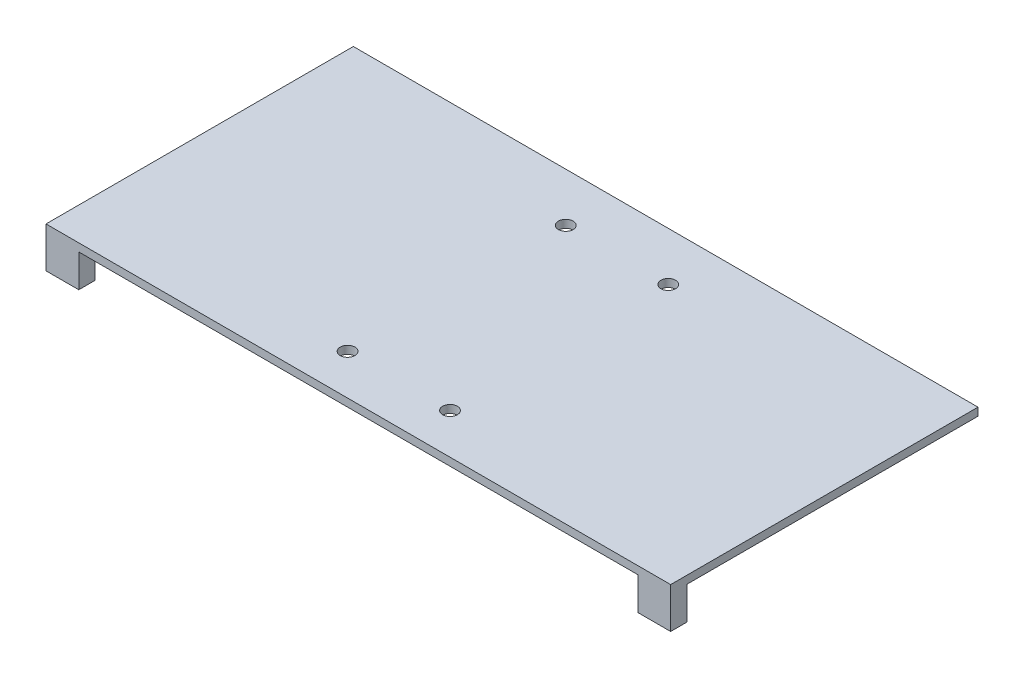
ISO-10303-21;
HEADER;
FILE_DESCRIPTION(('STEP AP214'),'2;1');
FILE_NAME('part.step','',(''),(''),'','','');
FILE_SCHEMA(('AUTOMOTIVE_DESIGN { 1 0 10303 214 1 1 1 1 }'));
ENDSEC;
DATA;
#1=APPLICATION_CONTEXT('core data for automotive mechanical design processes');
#2=APPLICATION_PROTOCOL_DEFINITION('international standard','automotive_design',2000,#1);
#3=PRODUCT_CONTEXT('',#1,'mechanical');
#4=PRODUCT('Part','Part','',(#3));
#5=PRODUCT_RELATED_PRODUCT_CATEGORY('part','',(#4));
#6=PRODUCT_DEFINITION_FORMATION('','',#4);
#7=PRODUCT_DEFINITION_CONTEXT('part definition',#1,'design');
#8=PRODUCT_DEFINITION('design','',#6,#7);
#9=PRODUCT_DEFINITION_SHAPE('','',#8);
#10=(LENGTH_UNIT() NAMED_UNIT(*) SI_UNIT(.MILLI.,.METRE.));
#11=(NAMED_UNIT(*) PLANE_ANGLE_UNIT() SI_UNIT($,.RADIAN.));
#12=(NAMED_UNIT(*) SI_UNIT($,.STERADIAN.) SOLID_ANGLE_UNIT());
#13=UNCERTAINTY_MEASURE_WITH_UNIT(LENGTH_MEASURE(1.E-05),#10,'distance_accuracy_value','');
#14=(GEOMETRIC_REPRESENTATION_CONTEXT(3) GLOBAL_UNCERTAINTY_ASSIGNED_CONTEXT((#13)) GLOBAL_UNIT_ASSIGNED_CONTEXT((#10,
#11,#12)) REPRESENTATION_CONTEXT('',''));
#15=CARTESIAN_POINT('',(0.,0.,0.));
#16=DIRECTION('',(0.,0.,1.));
#17=DIRECTION('',(1.,0.,0.));
#18=AXIS2_PLACEMENT_3D('',#15,#16,#17);
#19=CARTESIAN_POINT('',(0.,0.,0.));
#20=DIRECTION('',(0.,1.,0.));
#21=DIRECTION('',(0.,0.,1.));
#22=AXIS2_PLACEMENT_3D('',#19,#20,#21);
#23=PLANE('',#22);
#24=CARTESIAN_POINT('',(56.3375,0.,41.35437754));
#25=DIRECTION('',(0.,1.,0.));
#26=DIRECTION('',(0.,0.,1.));
#27=AXIS2_PLACEMENT_3D('',#24,#25,#26);
#28=CIRCLE('',#27,1.14299999999999);
#29=CARTESIAN_POINT('',(56.3375,0.,42.49737754));
#30=VERTEX_POINT('',#29);
#31=EDGE_CURVE('E181',#30,#30,#28,.F.);
#32=ORIENTED_EDGE('',*,*,#31,.F.);
#33=EDGE_LOOP('',(#32));
#34=FACE_BOUND('',#33,.T.);
#35=CARTESIAN_POINT('',(40.4625,0.,41.35437754));
#36=DIRECTION('',(0.,1.,0.));
#37=DIRECTION('',(0.,0.,1.));
#38=AXIS2_PLACEMENT_3D('',#35,#36,#37);
#39=CIRCLE('',#38,1.143);
#40=CARTESIAN_POINT('',(40.4625,0.,42.49737754));
#41=VERTEX_POINT('',#40);
#42=EDGE_CURVE('E182',#41,#41,#39,.F.);
#43=ORIENTED_EDGE('',*,*,#42,.F.);
#44=EDGE_LOOP('',(#43));
#45=FACE_BOUND('',#44,.T.);
#46=CARTESIAN_POINT('',(56.3375,0.,7.54062500000001));
#47=DIRECTION('',(0.,1.,0.));
#48=DIRECTION('',(0.,0.,1.));
#49=AXIS2_PLACEMENT_3D('',#46,#47,#48);
#50=CIRCLE('',#49,1.143);
#51=CARTESIAN_POINT('',(56.3375,0.,8.683625));
#52=VERTEX_POINT('',#51);
#53=EDGE_CURVE('E193',#52,#52,#50,.F.);
#54=ORIENTED_EDGE('',*,*,#53,.F.);
#55=EDGE_LOOP('',(#54));
#56=FACE_BOUND('',#55,.T.);
#57=CARTESIAN_POINT('',(40.4625,0.,7.54062500000001));
#58=DIRECTION('',(0.,1.,0.));
#59=DIRECTION('',(0.,0.,1.));
#60=AXIS2_PLACEMENT_3D('',#57,#58,#59);
#61=CIRCLE('',#60,1.143);
#62=CARTESIAN_POINT('',(40.4625,0.,8.683625));
#63=VERTEX_POINT('',#62);
#64=EDGE_CURVE('E194',#63,#63,#61,.F.);
#65=ORIENTED_EDGE('',*,*,#64,.F.);
#66=EDGE_LOOP('',(#65));
#67=FACE_BOUND('',#66,.T.);
#68=DIRECTION('',(1.,0.,0.));
#69=VECTOR('',#68,1.);
#70=CARTESIAN_POINT('',(0.,0.,45.08500254));
#71=LINE('',#70,#69);
#72=CARTESIAN_POINT('',(0.,0.,45.08500254));
#73=VERTEX_POINT('',#72);
#74=CARTESIAN_POINT('',(5.08000000000001,0.,45.08500254));
#75=VERTEX_POINT('',#74);
#76=EDGE_CURVE('E244',#73,#75,#71,.T.);
#77=ORIENTED_EDGE('',*,*,#76,.F.);
#78=DIRECTION('',(0.,0.,1.));
#79=VECTOR('',#78,1.);
#80=CARTESIAN_POINT('',(0.,0.,0.));
#81=LINE('',#80,#79);
#82=CARTESIAN_POINT('',(0.,0.,0.));
#83=VERTEX_POINT('',#82);
#84=EDGE_CURVE('E147',#83,#73,#81,.T.);
#85=ORIENTED_EDGE('',*,*,#84,.F.);
#86=DIRECTION('',(-1.,0.,0.));
#87=VECTOR('',#86,1.);
#88=CARTESIAN_POINT('',(0.,0.,0.));
#89=LINE('',#88,#87);
#90=CARTESIAN_POINT('',(96.799999948,0.,0.));
#91=VERTEX_POINT('',#90);
#92=EDGE_CURVE('E205',#91,#83,#89,.T.);
#93=ORIENTED_EDGE('',*,*,#92,.F.);
#94=DIRECTION('',(0.,0.,-1.));
#95=VECTOR('',#94,1.);
#96=CARTESIAN_POINT('',(96.799999948,0.,0.));
#97=LINE('',#96,#95);
#98=CARTESIAN_POINT('',(96.799999948,0.,45.08500254));
#99=VERTEX_POINT('',#98);
#100=EDGE_CURVE('E214',#99,#91,#97,.T.);
#101=ORIENTED_EDGE('',*,*,#100,.F.);
#102=DIRECTION('',(1.,0.,0.));
#103=VECTOR('',#102,1.);
#104=CARTESIAN_POINT('',(96.799999948,0.,45.08500254));
#105=LINE('',#104,#103);
#106=CARTESIAN_POINT('',(91.719999948,0.,45.08500254));
#107=VERTEX_POINT('',#106);
#108=EDGE_CURVE('E151',#107,#99,#105,.T.);
#109=ORIENTED_EDGE('',*,*,#108,.F.);
#110=DIRECTION('',(0.,0.,-1.));
#111=VECTOR('',#110,1.);
#112=CARTESIAN_POINT('',(91.719999948,0.,45.08500254));
#113=LINE('',#112,#111);
#114=CARTESIAN_POINT('',(91.719999948,0.,47.62500254));
#115=VERTEX_POINT('',#114);
#116=EDGE_CURVE('E148',#115,#107,#113,.T.);
#117=ORIENTED_EDGE('',*,*,#116,.F.);
#118=DIRECTION('',(1.,0.,0.));
#119=VECTOR('',#118,1.);
#120=CARTESIAN_POINT('',(0.,0.,47.62500254));
#121=LINE('',#120,#119);
#122=CARTESIAN_POINT('',(5.08000000000001,0.,47.62500254));
#123=VERTEX_POINT('',#122);
#124=EDGE_CURVE('E67',#123,#115,#121,.T.);
#125=ORIENTED_EDGE('',*,*,#124,.F.);
#126=DIRECTION('',(0.,0.,1.));
#127=VECTOR('',#126,1.);
#128=CARTESIAN_POINT('',(5.08000000000001,0.,47.62500254));
#129=LINE('',#128,#127);
#130=EDGE_CURVE('E142',#75,#123,#129,.T.);
#131=ORIENTED_EDGE('',*,*,#130,.F.);
#132=EDGE_LOOP('',(#77,#85,#93,#101,#109,#117,#125,#131));
#133=FACE_BOUND('',#132,.T.);
#134=ADVANCED_FACE('F47',(#34,#45,#56,#67,#133),#23,.F.);
#135=CARTESIAN_POINT('',(0.,1.2192,0.));
#136=DIRECTION('',(1.,0.,0.));
#137=DIRECTION('',(0.,0.,-1.));
#138=AXIS2_PLACEMENT_3D('',#135,#136,#137);
#139=PLANE('',#138);
#140=ORIENTED_EDGE('',*,*,#84,.T.);
#141=DIRECTION('',(0.,1.,0.));
#142=VECTOR('',#141,1.);
#143=CARTESIAN_POINT('',(0.,-5.08,45.08500254));
#144=LINE('',#143,#142);
#145=CARTESIAN_POINT('',(0.,-5.08,45.08500254));
#146=VERTEX_POINT('',#145);
#147=EDGE_CURVE('E127',#146,#73,#144,.T.);
#148=ORIENTED_EDGE('',*,*,#147,.F.);
#149=DIRECTION('',(0.,0.,-1.));
#150=VECTOR('',#149,1.);
#151=CARTESIAN_POINT('',(0.,-5.08,47.62500254));
#152=LINE('',#151,#150);
#153=CARTESIAN_POINT('',(0.,-5.08,47.62500254));
#154=VERTEX_POINT('',#153);
#155=EDGE_CURVE('E134',#154,#146,#152,.T.);
#156=ORIENTED_EDGE('',*,*,#155,.F.);
#157=DIRECTION('',(0.,-1.,0.));
#158=VECTOR('',#157,1.);
#159=CARTESIAN_POINT('',(0.,1.2192,47.62500254));
#160=LINE('',#159,#158);
#161=CARTESIAN_POINT('',(0.,1.2192,47.62500254));
#162=VERTEX_POINT('',#161);
#163=EDGE_CURVE('E13',#162,#154,#160,.T.);
#164=ORIENTED_EDGE('',*,*,#163,.F.);
#165=DIRECTION('',(0.,0.,1.));
#166=VECTOR('',#165,1.);
#167=CARTESIAN_POINT('',(0.,1.2192,0.));
#168=LINE('',#167,#166);
#169=CARTESIAN_POINT('',(0.,1.2192,0.));
#170=VERTEX_POINT('',#169);
#171=EDGE_CURVE('E201',#170,#162,#168,.T.);
#172=ORIENTED_EDGE('',*,*,#171,.F.);
#173=DIRECTION('',(0.,-1.,0.));
#174=VECTOR('',#173,1.);
#175=CARTESIAN_POINT('',(0.,1.2192,0.));
#176=LINE('',#175,#174);
#177=EDGE_CURVE('E211',#170,#83,#176,.T.);
#178=ORIENTED_EDGE('',*,*,#177,.T.);
#179=EDGE_LOOP('',(#140,#148,#156,#164,#172,#178));
#180=FACE_BOUND('',#179,.T.);
#181=ADVANCED_FACE('F49',(#180),#139,.F.);
#182=CARTESIAN_POINT('',(0.,1.2192,47.62500254));
#183=DIRECTION('',(0.,0.,-1.));
#184=DIRECTION('',(-1.,0.,0.));
#185=AXIS2_PLACEMENT_3D('',#182,#183,#184);
#186=PLANE('',#185);
#187=ORIENTED_EDGE('',*,*,#163,.T.);
#188=DIRECTION('',(-1.,0.,0.));
#189=VECTOR('',#188,1.);
#190=CARTESIAN_POINT('',(0.,-5.08,47.62500254));
#191=LINE('',#190,#189);
#192=CARTESIAN_POINT('',(5.08000000000001,-5.08,47.62500254));
#193=VERTEX_POINT('',#192);
#194=EDGE_CURVE('E139',#193,#154,#191,.T.);
#195=ORIENTED_EDGE('',*,*,#194,.F.);
#196=DIRECTION('',(0.,1.,0.));
#197=VECTOR('',#196,1.);
#198=CARTESIAN_POINT('',(5.08000000000001,-5.08,47.62500254));
#199=LINE('',#198,#197);
#200=EDGE_CURVE('E62',#193,#123,#199,.T.);
#201=ORIENTED_EDGE('',*,*,#200,.T.);
#202=ORIENTED_EDGE('',*,*,#124,.T.);
#203=DIRECTION('',(0.,1.,0.));
#204=VECTOR('',#203,1.);
#205=CARTESIAN_POINT('',(91.719999948,-5.08,47.62500254));
#206=LINE('',#205,#204);
#207=CARTESIAN_POINT('',(91.719999948,-5.08,47.62500254));
#208=VERTEX_POINT('',#207);
#209=EDGE_CURVE('E174',#208,#115,#206,.T.);
#210=ORIENTED_EDGE('',*,*,#209,.F.);
#211=DIRECTION('',(-1.,0.,0.));
#212=VECTOR('',#211,1.);
#213=CARTESIAN_POINT('',(91.719999948,-5.08,47.62500254));
#214=LINE('',#213,#212);
#215=CARTESIAN_POINT('',(96.799999948,-5.08,47.62500254));
#216=VERTEX_POINT('',#215);
#217=EDGE_CURVE('E156',#216,#208,#214,.T.);
#218=ORIENTED_EDGE('',*,*,#217,.F.);
#219=DIRECTION('',(0.,-1.,0.));
#220=VECTOR('',#219,1.);
#221=CARTESIAN_POINT('',(96.799999948,1.2192,47.62500254));
#222=LINE('',#221,#220);
#223=CARTESIAN_POINT('',(96.799999948,1.2192,47.62500254));
#224=VERTEX_POINT('',#223);
#225=EDGE_CURVE('E55',#224,#216,#222,.T.);
#226=ORIENTED_EDGE('',*,*,#225,.F.);
#227=DIRECTION('',(1.,0.,0.));
#228=VECTOR('',#227,1.);
#229=CARTESIAN_POINT('',(0.,1.2192,47.62500254));
#230=LINE('',#229,#228);
#231=EDGE_CURVE('E204',#162,#224,#230,.T.);
#232=ORIENTED_EDGE('',*,*,#231,.F.);
#233=EDGE_LOOP('',(#187,#195,#201,#202,#210,#218,#226,#232));
#234=FACE_BOUND('',#233,.T.);
#235=ADVANCED_FACE('F231',(#234),#186,.F.);
#236=CARTESIAN_POINT('',(96.799999948,1.2192,0.));
#237=DIRECTION('',(-1.,0.,0.));
#238=DIRECTION('',(0.,0.,1.));
#239=AXIS2_PLACEMENT_3D('',#236,#237,#238);
#240=PLANE('',#239);
#241=ORIENTED_EDGE('',*,*,#225,.T.);
#242=DIRECTION('',(0.,0.,1.));
#243=VECTOR('',#242,1.);
#244=CARTESIAN_POINT('',(96.799999948,-5.08,47.62500254));
#245=LINE('',#244,#243);
#246=CARTESIAN_POINT('',(96.799999948,-5.08,45.08500254));
#247=VERTEX_POINT('',#246);
#248=EDGE_CURVE('E163',#247,#216,#245,.T.);
#249=ORIENTED_EDGE('',*,*,#248,.F.);
#250=DIRECTION('',(0.,1.,0.));
#251=VECTOR('',#250,1.);
#252=CARTESIAN_POINT('',(96.799999948,-5.08,45.08500254));
#253=LINE('',#252,#251);
#254=EDGE_CURVE('E165',#247,#99,#253,.T.);
#255=ORIENTED_EDGE('',*,*,#254,.T.);
#256=ORIENTED_EDGE('',*,*,#100,.T.);
#257=DIRECTION('',(0.,-1.,0.));
#258=VECTOR('',#257,1.);
#259=CARTESIAN_POINT('',(96.799999948,1.2192,0.));
#260=LINE('',#259,#258);
#261=CARTESIAN_POINT('',(96.799999948,1.2192,0.));
#262=VERTEX_POINT('',#261);
#263=EDGE_CURVE('E218',#262,#91,#260,.T.);
#264=ORIENTED_EDGE('',*,*,#263,.F.);
#265=DIRECTION('',(0.,0.,-1.));
#266=VECTOR('',#265,1.);
#267=CARTESIAN_POINT('',(96.799999948,1.2192,0.));
#268=LINE('',#267,#266);
#269=EDGE_CURVE('E207',#224,#262,#268,.T.);
#270=ORIENTED_EDGE('',*,*,#269,.F.);
#271=EDGE_LOOP('',(#241,#249,#255,#256,#264,#270));
#272=FACE_BOUND('',#271,.T.);
#273=ADVANCED_FACE('F224',(#272),#240,.F.);
#274=CARTESIAN_POINT('',(0.,1.2192,0.));
#275=DIRECTION('',(0.,0.,1.));
#276=DIRECTION('',(1.,0.,0.));
#277=AXIS2_PLACEMENT_3D('',#274,#275,#276);
#278=PLANE('',#277);
#279=ORIENTED_EDGE('',*,*,#92,.T.);
#280=ORIENTED_EDGE('',*,*,#177,.F.);
#281=DIRECTION('',(-1.,0.,0.));
#282=VECTOR('',#281,1.);
#283=CARTESIAN_POINT('',(0.,1.2192,0.));
#284=LINE('',#283,#282);
#285=EDGE_CURVE('E209',#262,#170,#284,.T.);
#286=ORIENTED_EDGE('',*,*,#285,.F.);
#287=ORIENTED_EDGE('',*,*,#263,.T.);
#288=EDGE_LOOP('',(#279,#280,#286,#287));
#289=FACE_BOUND('',#288,.T.);
#290=ADVANCED_FACE('F241',(#289),#278,.F.);
#291=CARTESIAN_POINT('',(0.,1.2192,0.));
#292=DIRECTION('',(0.,1.,0.));
#293=DIRECTION('',(0.,0.,1.));
#294=AXIS2_PLACEMENT_3D('',#291,#292,#293);
#295=PLANE('',#294);
#296=CARTESIAN_POINT('',(56.3375,1.2192,41.35437754));
#297=DIRECTION('',(0.,1.,0.));
#298=DIRECTION('',(0.,0.,1.));
#299=AXIS2_PLACEMENT_3D('',#296,#297,#298);
#300=CIRCLE('',#299,1.14299999999999);
#301=CARTESIAN_POINT('',(56.3375,1.2192,42.49737754));
#302=VERTEX_POINT('',#301);
#303=EDGE_CURVE('E178',#302,#302,#300,.T.);
#304=ORIENTED_EDGE('',*,*,#303,.F.);
#305=EDGE_LOOP('',(#304));
#306=FACE_BOUND('',#305,.T.);
#307=CARTESIAN_POINT('',(40.4625,1.2192,41.35437754));
#308=DIRECTION('',(0.,1.,0.));
#309=DIRECTION('',(0.,0.,1.));
#310=AXIS2_PLACEMENT_3D('',#307,#308,#309);
#311=CIRCLE('',#310,1.143);
#312=CARTESIAN_POINT('',(40.4625,1.2192,42.49737754));
#313=VERTEX_POINT('',#312);
#314=EDGE_CURVE('E177',#313,#313,#311,.T.);
#315=ORIENTED_EDGE('',*,*,#314,.F.);
#316=EDGE_LOOP('',(#315));
#317=FACE_BOUND('',#316,.T.);
#318=CARTESIAN_POINT('',(56.3375,1.2192,7.54062500000001));
#319=DIRECTION('',(0.,1.,0.));
#320=DIRECTION('',(0.,0.,1.));
#321=AXIS2_PLACEMENT_3D('',#318,#319,#320);
#322=CIRCLE('',#321,1.143);
#323=CARTESIAN_POINT('',(56.3375,1.2192,8.683625));
#324=VERTEX_POINT('',#323);
#325=EDGE_CURVE('E190',#324,#324,#322,.T.);
#326=ORIENTED_EDGE('',*,*,#325,.F.);
#327=EDGE_LOOP('',(#326));
#328=FACE_BOUND('',#327,.T.);
#329=CARTESIAN_POINT('',(40.4625,1.2192,7.54062500000001));
#330=DIRECTION('',(0.,1.,0.));
#331=DIRECTION('',(0.,0.,1.));
#332=AXIS2_PLACEMENT_3D('',#329,#330,#331);
#333=CIRCLE('',#332,1.143);
#334=CARTESIAN_POINT('',(40.4625,1.2192,8.683625));
#335=VERTEX_POINT('',#334);
#336=EDGE_CURVE('E185',#335,#335,#333,.T.);
#337=ORIENTED_EDGE('',*,*,#336,.F.);
#338=EDGE_LOOP('',(#337));
#339=FACE_BOUND('',#338,.T.);
#340=ORIENTED_EDGE('',*,*,#171,.T.);
#341=ORIENTED_EDGE('',*,*,#231,.T.);
#342=ORIENTED_EDGE('',*,*,#269,.T.);
#343=ORIENTED_EDGE('',*,*,#285,.T.);
#344=EDGE_LOOP('',(#340,#341,#342,#343));
#345=FACE_BOUND('',#344,.T.);
#346=ADVANCED_FACE('F253',(#306,#317,#328,#339,#345),#295,.T.);
#347=CARTESIAN_POINT('',(40.4625,-0.000999999999999916,7.54062500000001));
#348=DIRECTION('',(0.,1.,0.));
#349=DIRECTION('',(0.,0.,1.));
#350=AXIS2_PLACEMENT_3D('',#347,#348,#349);
#351=CYLINDRICAL_SURFACE('',#350,1.143);
#352=ORIENTED_EDGE('',*,*,#336,.T.);
#353=EDGE_LOOP('',(#352));
#354=FACE_BOUND('',#353,.T.);
#355=ORIENTED_EDGE('',*,*,#64,.T.);
#356=EDGE_LOOP('',(#355));
#357=FACE_BOUND('',#356,.T.);
#358=ADVANCED_FACE('F255',(#354,#357),#351,.F.);
#359=CARTESIAN_POINT('',(56.3375,-0.000999999999999916,7.54062500000001));
#360=DIRECTION('',(0.,1.,0.));
#361=DIRECTION('',(0.,0.,1.));
#362=AXIS2_PLACEMENT_3D('',#359,#360,#361);
#363=CYLINDRICAL_SURFACE('',#362,1.143);
#364=ORIENTED_EDGE('',*,*,#325,.T.);
#365=EDGE_LOOP('',(#364));
#366=FACE_BOUND('',#365,.T.);
#367=ORIENTED_EDGE('',*,*,#53,.T.);
#368=EDGE_LOOP('',(#367));
#369=FACE_BOUND('',#368,.T.);
#370=ADVANCED_FACE('F262',(#366,#369),#363,.F.);
#371=CARTESIAN_POINT('',(40.4625,-0.000999999999999916,41.35437754));
#372=DIRECTION('',(0.,1.,0.));
#373=DIRECTION('',(0.,0.,1.));
#374=AXIS2_PLACEMENT_3D('',#371,#372,#373);
#375=CYLINDRICAL_SURFACE('',#374,1.143);
#376=ORIENTED_EDGE('',*,*,#314,.T.);
#377=EDGE_LOOP('',(#376));
#378=FACE_BOUND('',#377,.T.);
#379=ORIENTED_EDGE('',*,*,#42,.T.);
#380=EDGE_LOOP('',(#379));
#381=FACE_BOUND('',#380,.T.);
#382=ADVANCED_FACE('F308',(#378,#381),#375,.F.);
#383=CARTESIAN_POINT('',(56.3375,-0.000999999999999916,41.35437754));
#384=DIRECTION('',(0.,1.,0.));
#385=DIRECTION('',(0.,0.,1.));
#386=AXIS2_PLACEMENT_3D('',#383,#384,#385);
#387=CYLINDRICAL_SURFACE('',#386,1.14299999999999);
#388=ORIENTED_EDGE('',*,*,#303,.T.);
#389=EDGE_LOOP('',(#388));
#390=FACE_BOUND('',#389,.T.);
#391=ORIENTED_EDGE('',*,*,#31,.T.);
#392=EDGE_LOOP('',(#391));
#393=FACE_BOUND('',#392,.T.);
#394=ADVANCED_FACE('F322',(#390,#393),#387,.F.);
#395=CARTESIAN_POINT('',(91.719999948,-5.08,45.08500254));
#396=DIRECTION('',(1.,0.,0.));
#397=DIRECTION('',(0.,0.,-1.));
#398=AXIS2_PLACEMENT_3D('',#395,#396,#397);
#399=PLANE('',#398);
#400=ORIENTED_EDGE('',*,*,#116,.T.);
#401=DIRECTION('',(0.,1.,0.));
#402=VECTOR('',#401,1.);
#403=CARTESIAN_POINT('',(91.719999948,-5.08,45.08500254));
#404=LINE('',#403,#402);
#405=CARTESIAN_POINT('',(91.719999948,-5.08,45.08500254));
#406=VERTEX_POINT('',#405);
#407=EDGE_CURVE('E171',#406,#107,#404,.T.);
#408=ORIENTED_EDGE('',*,*,#407,.F.);
#409=DIRECTION('',(0.,0.,-1.));
#410=VECTOR('',#409,1.);
#411=CARTESIAN_POINT('',(91.719999948,-5.08,45.08500254));
#412=LINE('',#411,#410);
#413=EDGE_CURVE('E159',#208,#406,#412,.T.);
#414=ORIENTED_EDGE('',*,*,#413,.F.);
#415=ORIENTED_EDGE('',*,*,#209,.T.);
#416=EDGE_LOOP('',(#400,#408,#414,#415));
#417=FACE_BOUND('',#416,.T.);
#418=ADVANCED_FACE('F233',(#417),#399,.F.);
#419=CARTESIAN_POINT('',(96.799999948,-5.08,45.08500254));
#420=DIRECTION('',(0.,0.,1.));
#421=DIRECTION('',(1.,0.,0.));
#422=AXIS2_PLACEMENT_3D('',#419,#420,#421);
#423=PLANE('',#422);
#424=ORIENTED_EDGE('',*,*,#108,.T.);
#425=ORIENTED_EDGE('',*,*,#254,.F.);
#426=DIRECTION('',(1.,0.,0.));
#427=VECTOR('',#426,1.);
#428=CARTESIAN_POINT('',(96.799999948,-5.08,45.08500254));
#429=LINE('',#428,#427);
#430=EDGE_CURVE('E161',#406,#247,#429,.T.);
#431=ORIENTED_EDGE('',*,*,#430,.F.);
#432=ORIENTED_EDGE('',*,*,#407,.T.);
#433=EDGE_LOOP('',(#424,#425,#431,#432));
#434=FACE_BOUND('',#433,.T.);
#435=ADVANCED_FACE('F236',(#434),#423,.F.);
#436=CARTESIAN_POINT('',(0.,-5.08,0.));
#437=DIRECTION('',(0.,1.,0.));
#438=DIRECTION('',(0.,0.,1.));
#439=AXIS2_PLACEMENT_3D('',#436,#437,#438);
#440=PLANE('',#439);
#441=ORIENTED_EDGE('',*,*,#217,.T.);
#442=ORIENTED_EDGE('',*,*,#413,.T.);
#443=ORIENTED_EDGE('',*,*,#430,.T.);
#444=ORIENTED_EDGE('',*,*,#248,.T.);
#445=EDGE_LOOP('',(#441,#442,#443,#444));
#446=FACE_BOUND('',#445,.T.);
#447=ADVANCED_FACE('F228',(#446),#440,.F.);
#448=CARTESIAN_POINT('',(0.,-5.08,45.08500254));
#449=DIRECTION('',(0.,0.,1.));
#450=DIRECTION('',(1.,0.,0.));
#451=AXIS2_PLACEMENT_3D('',#448,#449,#450);
#452=PLANE('',#451);
#453=ORIENTED_EDGE('',*,*,#76,.T.);
#454=DIRECTION('',(0.,1.,0.));
#455=VECTOR('',#454,1.);
#456=CARTESIAN_POINT('',(5.08000000000001,-5.08,45.08500254));
#457=LINE('',#456,#455);
#458=CARTESIAN_POINT('',(5.08000000000001,-5.08,45.08500254));
#459=VERTEX_POINT('',#458);
#460=EDGE_CURVE('E130',#459,#75,#457,.T.);
#461=ORIENTED_EDGE('',*,*,#460,.F.);
#462=DIRECTION('',(1.,0.,0.));
#463=VECTOR('',#462,1.);
#464=CARTESIAN_POINT('',(0.,-5.08,45.08500254));
#465=LINE('',#464,#463);
#466=EDGE_CURVE('E123',#146,#459,#465,.T.);
#467=ORIENTED_EDGE('',*,*,#466,.F.);
#468=ORIENTED_EDGE('',*,*,#147,.T.);
#469=EDGE_LOOP('',(#453,#461,#467,#468));
#470=FACE_BOUND('',#469,.T.);
#471=ADVANCED_FACE('F125',(#470),#452,.F.);
#472=CARTESIAN_POINT('',(5.08000000000001,-5.08,47.62500254));
#473=DIRECTION('',(-1.,0.,0.));
#474=DIRECTION('',(0.,0.,1.));
#475=AXIS2_PLACEMENT_3D('',#472,#473,#474);
#476=PLANE('',#475);
#477=ORIENTED_EDGE('',*,*,#130,.T.);
#478=ORIENTED_EDGE('',*,*,#200,.F.);
#479=DIRECTION('',(0.,0.,1.));
#480=VECTOR('',#479,1.);
#481=CARTESIAN_POINT('',(5.08000000000001,-5.08,47.62500254));
#482=LINE('',#481,#480);
#483=EDGE_CURVE('E133',#459,#193,#482,.T.);
#484=ORIENTED_EDGE('',*,*,#483,.F.);
#485=ORIENTED_EDGE('',*,*,#460,.T.);
#486=EDGE_LOOP('',(#477,#478,#484,#485));
#487=FACE_BOUND('',#486,.T.);
#488=ADVANCED_FACE('F250',(#487),#476,.F.);
#489=CARTESIAN_POINT('',(0.,-5.08,0.));
#490=DIRECTION('',(0.,-1.,0.));
#491=DIRECTION('',(0.,0.,-1.));
#492=AXIS2_PLACEMENT_3D('',#489,#490,#491);
#493=PLANE('',#492);
#494=ORIENTED_EDGE('',*,*,#155,.T.);
#495=ORIENTED_EDGE('',*,*,#466,.T.);
#496=ORIENTED_EDGE('',*,*,#483,.T.);
#497=ORIENTED_EDGE('',*,*,#194,.T.);
#498=EDGE_LOOP('',(#494,#495,#496,#497));
#499=FACE_BOUND('',#498,.T.);
#500=ADVANCED_FACE('F138',(#499),#493,.T.);
#501=CLOSED_SHELL('',(#134,#181,#235,#273,#290,#346,#358,#370,#382,#394,#418,#435,#447,#471,
#488,#500));
#502=MANIFOLD_SOLID_BREP('B2',#501);
#503=ADVANCED_BREP_SHAPE_REPRESENTATION('',(#18,#502),#14);
#504=SHAPE_DEFINITION_REPRESENTATION(#9,#503);
ENDSEC;
END-ISO-10303-21;
